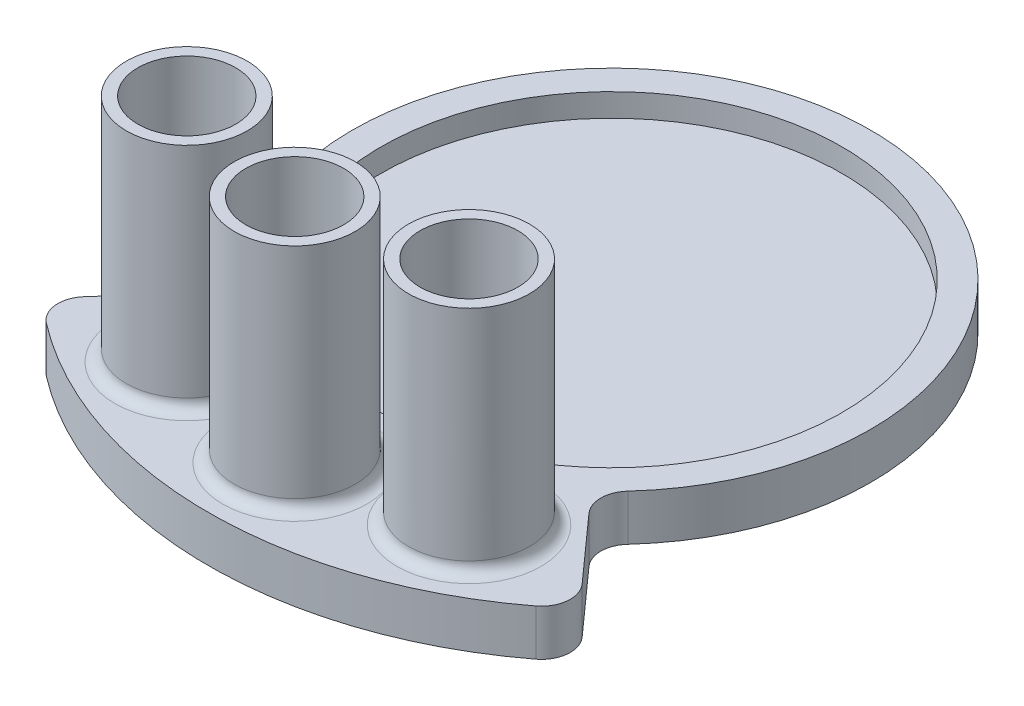
ISO-10303-21;
HEADER;
FILE_DESCRIPTION(('STEP AP214'),'2;1');
FILE_NAME('part.step','',(''),(''),'','','');
FILE_SCHEMA(('AUTOMOTIVE_DESIGN { 1 0 10303 214 1 1 1 1 }'));
ENDSEC;
DATA;
#1=APPLICATION_CONTEXT('core data for automotive mechanical design processes');
#2=APPLICATION_PROTOCOL_DEFINITION('international standard','automotive_design',2000,#1);
#3=PRODUCT_CONTEXT('',#1,'mechanical');
#4=PRODUCT('Part','Part','',(#3));
#5=PRODUCT_RELATED_PRODUCT_CATEGORY('part','',(#4));
#6=PRODUCT_DEFINITION_FORMATION('','',#4);
#7=PRODUCT_DEFINITION_CONTEXT('part definition',#1,'design');
#8=PRODUCT_DEFINITION('design','',#6,#7);
#9=PRODUCT_DEFINITION_SHAPE('','',#8);
#10=(LENGTH_UNIT() NAMED_UNIT(*) SI_UNIT(.MILLI.,.METRE.));
#11=(NAMED_UNIT(*) PLANE_ANGLE_UNIT() SI_UNIT($,.RADIAN.));
#12=(NAMED_UNIT(*) SI_UNIT($,.STERADIAN.) SOLID_ANGLE_UNIT());
#13=UNCERTAINTY_MEASURE_WITH_UNIT(LENGTH_MEASURE(1.E-05),#10,'distance_accuracy_value','');
#14=(GEOMETRIC_REPRESENTATION_CONTEXT(3) GLOBAL_UNCERTAINTY_ASSIGNED_CONTEXT((#13)) GLOBAL_UNIT_ASSIGNED_CONTEXT((#10,
#11,#12)) REPRESENTATION_CONTEXT('',''));
#15=CARTESIAN_POINT('',(0.,0.,0.));
#16=DIRECTION('',(0.,0.,1.));
#17=DIRECTION('',(1.,0.,0.));
#18=AXIS2_PLACEMENT_3D('',#15,#16,#17);
#19=CARTESIAN_POINT('',(0.,8.,0.));
#20=DIRECTION('',(0.,-1.,0.));
#21=DIRECTION('',(0.,0.,-1.));
#22=AXIS2_PLACEMENT_3D('',#19,#20,#21);
#23=CYLINDRICAL_SURFACE('',#22,45.);
#24=CARTESIAN_POINT('',(0.,0.,0.));
#25=DIRECTION('',(0.,1.,0.));
#26=DIRECTION('',(0.,0.,1.));
#27=AXIS2_PLACEMENT_3D('',#24,#25,#26);
#28=CIRCLE('',#27,45.);
#29=CARTESIAN_POINT('',(33.2037250794483,0.,30.3728931919305));
#30=VERTEX_POINT('',#29);
#31=CARTESIAN_POINT('',(-33.2037250794483,0.,30.3728931919305));
#32=VERTEX_POINT('',#31);
#33=EDGE_CURVE('E224',#30,#32,#28,.T.);
#34=ORIENTED_EDGE('',*,*,#33,.T.);
#35=DIRECTION('',(0.,-1.,0.));
#36=VECTOR('',#35,1.);
#37=CARTESIAN_POINT('',(-33.2037250794483,8.,30.3728931919305));
#38=LINE('',#37,#36);
#39=CARTESIAN_POINT('',(-33.2037250794483,8.,30.3728931919305));
#40=VERTEX_POINT('',#39);
#41=EDGE_CURVE('E153',#32,#40,#38,.F.);
#42=ORIENTED_EDGE('',*,*,#41,.T.);
#43=CARTESIAN_POINT('',(0.,8.,0.));
#44=DIRECTION('',(0.,1.,0.));
#45=DIRECTION('',(0.,0.,1.));
#46=AXIS2_PLACEMENT_3D('',#43,#44,#45);
#47=CIRCLE('',#46,45.);
#48=CARTESIAN_POINT('',(33.2037250794483,8.,30.3728931919305));
#49=VERTEX_POINT('',#48);
#50=EDGE_CURVE('E128',#49,#40,#47,.T.);
#51=ORIENTED_EDGE('',*,*,#50,.F.);
#52=DIRECTION('',(0.,-1.,0.));
#53=VECTOR('',#52,1.);
#54=CARTESIAN_POINT('',(33.2037250794483,8.,30.3728931919305));
#55=LINE('',#54,#53);
#56=EDGE_CURVE('E150',#49,#30,#55,.T.);
#57=ORIENTED_EDGE('',*,*,#56,.T.);
#58=EDGE_LOOP('',(#34,#42,#51,#57));
#59=FACE_BOUND('',#58,.T.);
#60=ADVANCED_FACE('F35',(#59),#23,.T.);
#61=CARTESIAN_POINT('',(-30.,8.,33.5410196624968));
#62=DIRECTION('',(0.745355992499929,0.,0.666666666666667));
#63=DIRECTION('',(0.666666666666667,0.,-0.74535599249993));
#64=AXIS2_PLACEMENT_3D('',#61,#62,#63);
#65=PLANE('',#64);
#66=DIRECTION('',(-0.666666666666667,0.,0.745355992499929));
#67=VECTOR('',#66,1.);
#68=CARTESIAN_POINT('',(-30.,0.,33.5410196624968));
#69=LINE('',#68,#67);
#70=CARTESIAN_POINT('',(-33.166247903554,0.,37.0809924354783));
#71=VERTEX_POINT('',#70);
#72=CARTESIAN_POINT('',(-43.2049379893857,0.,48.3045891539648));
#73=VERTEX_POINT('',#72);
#74=EDGE_CURVE('E133',#71,#73,#69,.T.);
#75=ORIENTED_EDGE('',*,*,#74,.T.);
#76=DIRECTION('',(0.,-1.,0.));
#77=VECTOR('',#76,1.);
#78=CARTESIAN_POINT('',(-43.2049379893858,8.,48.3045891539648));
#79=LINE('',#78,#77);
#80=CARTESIAN_POINT('',(-43.2049379893857,8.,48.3045891539648));
#81=VERTEX_POINT('',#80);
#82=EDGE_CURVE('E50',#73,#81,#79,.F.);
#83=ORIENTED_EDGE('',*,*,#82,.T.);
#84=DIRECTION('',(-0.666666666666667,0.,0.745355992499929));
#85=VECTOR('',#84,1.);
#86=CARTESIAN_POINT('',(-30.,8.,33.5410196624968));
#87=LINE('',#86,#85);
#88=CARTESIAN_POINT('',(-33.166247903554,8.,37.0809924354783));
#89=VERTEX_POINT('',#88);
#90=EDGE_CURVE('E131',#89,#81,#87,.T.);
#91=ORIENTED_EDGE('',*,*,#90,.F.);
#92=DIRECTION('',(0.,1.,0.));
#93=VECTOR('',#92,1.);
#94=CARTESIAN_POINT('',(-33.166247903554,0.,37.0809924354783));
#95=LINE('',#94,#93);
#96=EDGE_CURVE('E146',#89,#71,#95,.F.);
#97=ORIENTED_EDGE('',*,*,#96,.T.);
#98=EDGE_LOOP('',(#75,#83,#91,#97));
#99=FACE_BOUND('',#98,.T.);
#100=ADVANCED_FACE('F192',(#99),#65,.F.);
#101=CARTESIAN_POINT('',(0.,8.,0.));
#102=DIRECTION('',(0.,-1.,0.));
#103=DIRECTION('',(0.,0.,-1.));
#104=AXIS2_PLACEMENT_3D('',#101,#102,#103);
#105=CYLINDRICAL_SURFACE('',#104,70.);
#106=CARTESIAN_POINT('',(0.,0.,0.));
#107=DIRECTION('',(0.,1.,0.));
#108=DIRECTION('',(0.,0.,1.));
#109=AXIS2_PLACEMENT_3D('',#106,#107,#108);
#110=CIRCLE('',#109,70.);
#111=CARTESIAN_POINT('',(-42.5149394135696,0.,55.6100703709364));
#112=VERTEX_POINT('',#111);
#113=CARTESIAN_POINT('',(42.5149394135697,0.,55.6100703709364));
#114=VERTEX_POINT('',#113);
#115=EDGE_CURVE('E129',#112,#114,#110,.T.);
#116=ORIENTED_EDGE('',*,*,#115,.T.);
#117=DIRECTION('',(0.,-1.,0.));
#118=VECTOR('',#117,1.);
#119=CARTESIAN_POINT('',(42.5149394135697,8.,55.6100703709364));
#120=LINE('',#119,#118);
#121=CARTESIAN_POINT('',(42.5149394135697,8.,55.6100703709364));
#122=VERTEX_POINT('',#121);
#123=EDGE_CURVE('E107',#114,#122,#120,.F.);
#124=ORIENTED_EDGE('',*,*,#123,.T.);
#125=CARTESIAN_POINT('',(0.,8.,0.));
#126=DIRECTION('',(0.,1.,0.));
#127=DIRECTION('',(0.,0.,1.));
#128=AXIS2_PLACEMENT_3D('',#125,#126,#127);
#129=CIRCLE('',#128,70.);
#130=CARTESIAN_POINT('',(-42.5149394135696,8.,55.6100703709364));
#131=VERTEX_POINT('',#130);
#132=EDGE_CURVE('E231',#131,#122,#129,.T.);
#133=ORIENTED_EDGE('',*,*,#132,.F.);
#134=DIRECTION('',(0.,-1.,0.));
#135=VECTOR('',#134,1.);
#136=CARTESIAN_POINT('',(-42.5149394135696,8.,55.6100703709364));
#137=LINE('',#136,#135);
#138=EDGE_CURVE('E112',#131,#112,#137,.T.);
#139=ORIENTED_EDGE('',*,*,#138,.T.);
#140=EDGE_LOOP('',(#116,#124,#133,#139));
#141=FACE_BOUND('',#140,.T.);
#142=ADVANCED_FACE('F198',(#141),#105,.T.);
#143=CARTESIAN_POINT('',(30.,8.,33.5410196624968));
#144=DIRECTION('',(-0.745355992499929,0.,0.666666666666667));
#145=DIRECTION('',(0.666666666666667,0.,0.745355992499929));
#146=AXIS2_PLACEMENT_3D('',#143,#144,#145);
#147=PLANE('',#146);
#148=DIRECTION('',(-0.666666666666667,0.,-0.745355992499929));
#149=VECTOR('',#148,1.);
#150=CARTESIAN_POINT('',(30.,8.,33.5410196624968));
#151=LINE('',#150,#149);
#152=CARTESIAN_POINT('',(43.2049379893858,8.,48.3045891539648));
#153=VERTEX_POINT('',#152);
#154=CARTESIAN_POINT('',(33.166247903554,8.,37.0809924354783));
#155=VERTEX_POINT('',#154);
#156=EDGE_CURVE('E122',#153,#155,#151,.T.);
#157=ORIENTED_EDGE('',*,*,#156,.F.);
#158=DIRECTION('',(0.,-1.,0.));
#159=VECTOR('',#158,1.);
#160=CARTESIAN_POINT('',(43.2049379893858,8.,48.3045891539648));
#161=LINE('',#160,#159);
#162=CARTESIAN_POINT('',(43.2049379893858,0.,48.3045891539648));
#163=VERTEX_POINT('',#162);
#164=EDGE_CURVE('E106',#153,#163,#161,.T.);
#165=ORIENTED_EDGE('',*,*,#164,.T.);
#166=DIRECTION('',(-0.666666666666667,0.,-0.745355992499929));
#167=VECTOR('',#166,1.);
#168=CARTESIAN_POINT('',(30.,0.,33.5410196624968));
#169=LINE('',#168,#167);
#170=CARTESIAN_POINT('',(33.166247903554,0.,37.0809924354783));
#171=VERTEX_POINT('',#170);
#172=EDGE_CURVE('E119',#163,#171,#169,.T.);
#173=ORIENTED_EDGE('',*,*,#172,.T.);
#174=DIRECTION('',(0.,1.,0.));
#175=VECTOR('',#174,1.);
#176=CARTESIAN_POINT('',(33.166247903554,8.,37.0809924354783));
#177=LINE('',#176,#175);
#178=EDGE_CURVE('E123',#171,#155,#177,.T.);
#179=ORIENTED_EDGE('',*,*,#178,.T.);
#180=EDGE_LOOP('',(#157,#165,#173,#179));
#181=FACE_BOUND('',#180,.T.);
#182=ADVANCED_FACE('F118',(#181),#147,.F.);
#183=CARTESIAN_POINT('',(0.,8.,0.));
#184=DIRECTION('',(0.,1.,0.));
#185=DIRECTION('',(0.,0.,1.));
#186=AXIS2_PLACEMENT_3D('',#183,#184,#185);
#187=PLANE('',#186);
#188=CARTESIAN_POINT('',(24.5,8.,49.2417505781425));
#189=DIRECTION('',(0.,1.,0.));
#190=DIRECTION('',(0.,0.,1.));
#191=AXIS2_PLACEMENT_3D('',#188,#189,#190);
#192=CIRCLE('',#191,12.5);
#193=CARTESIAN_POINT('',(24.5,8.,61.7417505781425));
#194=VERTEX_POINT('',#193);
#195=EDGE_CURVE('E170',#194,#194,#192,.F.);
#196=ORIENTED_EDGE('',*,*,#195,.T.);
#197=EDGE_LOOP('',(#196));
#198=FACE_BOUND('',#197,.T.);
#199=CARTESIAN_POINT('',(0.,8.,55.));
#200=DIRECTION('',(0.,1.,0.));
#201=DIRECTION('',(0.,0.,1.));
#202=AXIS2_PLACEMENT_3D('',#199,#200,#201);
#203=CIRCLE('',#202,12.5);
#204=CARTESIAN_POINT('',(0.,8.,67.5));
#205=VERTEX_POINT('',#204);
#206=EDGE_CURVE('E167',#205,#205,#203,.F.);
#207=ORIENTED_EDGE('',*,*,#206,.T.);
#208=EDGE_LOOP('',(#207));
#209=FACE_BOUND('',#208,.T.);
#210=CARTESIAN_POINT('',(-24.5,8.,49.2417505781425));
#211=DIRECTION('',(0.,1.,0.));
#212=DIRECTION('',(0.,0.,1.));
#213=AXIS2_PLACEMENT_3D('',#210,#211,#212);
#214=CIRCLE('',#213,12.5);
#215=CARTESIAN_POINT('',(-24.5,8.,61.7417505781425));
#216=VERTEX_POINT('',#215);
#217=EDGE_CURVE('E164',#216,#216,#214,.F.);
#218=ORIENTED_EDGE('',*,*,#217,.T.);
#219=EDGE_LOOP('',(#218));
#220=FACE_BOUND('',#219,.T.);
#221=CARTESIAN_POINT('',(0.,8.,0.));
#222=DIRECTION('',(0.,1.,0.));
#223=DIRECTION('',(0.,0.,1.));
#224=AXIS2_PLACEMENT_3D('',#221,#222,#223);
#225=CIRCLE('',#224,40.);
#226=CARTESIAN_POINT('',(0.,8.,40.));
#227=VERTEX_POINT('',#226);
#228=EDGE_CURVE('E234',#227,#227,#225,.T.);
#229=ORIENTED_EDGE('',*,*,#228,.F.);
#230=EDGE_LOOP('',(#229));
#231=FACE_BOUND('',#230,.T.);
#232=ORIENTED_EDGE('',*,*,#132,.T.);
#233=CARTESIAN_POINT('',(39.4781580268861,8.,51.6379224872981));
#234=DIRECTION('',(0.,1.,0.));
#235=DIRECTION('',(0.,0.,1.));
#236=AXIS2_PLACEMENT_3D('',#233,#234,#235);
#237=CIRCLE('',#236,5.);
#238=EDGE_CURVE('E144',#122,#153,#237,.T.);
#239=ORIENTED_EDGE('',*,*,#238,.T.);
#240=ORIENTED_EDGE('',*,*,#156,.T.);
#241=CARTESIAN_POINT('',(36.8930278660537,8.,33.747659102145));
#242=DIRECTION('',(0.,1.,0.));
#243=DIRECTION('',(0.,0.,1.));
#244=AXIS2_PLACEMENT_3D('',#241,#242,#243);
#245=CIRCLE('',#244,5.);
#246=EDGE_CURVE('E159',#155,#49,#245,.F.);
#247=ORIENTED_EDGE('',*,*,#246,.T.);
#248=ORIENTED_EDGE('',*,*,#50,.T.);
#249=CARTESIAN_POINT('',(-36.8930278660537,8.,33.747659102145));
#250=DIRECTION('',(0.,1.,0.));
#251=DIRECTION('',(0.,0.,1.));
#252=AXIS2_PLACEMENT_3D('',#249,#250,#251);
#253=CIRCLE('',#252,5.);
#254=EDGE_CURVE('E57',#40,#89,#253,.F.);
#255=ORIENTED_EDGE('',*,*,#254,.T.);
#256=ORIENTED_EDGE('',*,*,#90,.T.);
#257=CARTESIAN_POINT('',(-39.4781580268861,8.,51.6379224872981));
#258=DIRECTION('',(0.,1.,0.));
#259=DIRECTION('',(0.,0.,1.));
#260=AXIS2_PLACEMENT_3D('',#257,#258,#259);
#261=CIRCLE('',#260,5.);
#262=EDGE_CURVE('E142',#81,#131,#261,.T.);
#263=ORIENTED_EDGE('',*,*,#262,.T.);
#264=EDGE_LOOP('',(#232,#239,#240,#247,#248,#255,#256,#263));
#265=FACE_BOUND('',#264,.T.);
#266=ADVANCED_FACE('F222',(#198,#209,#220,#231,#265),#187,.T.);
#267=CARTESIAN_POINT('',(0.,0.,0.));
#268=DIRECTION('',(0.,1.,0.));
#269=DIRECTION('',(0.,0.,1.));
#270=AXIS2_PLACEMENT_3D('',#267,#268,#269);
#271=PLANE('',#270);
#272=ORIENTED_EDGE('',*,*,#172,.F.);
#273=CARTESIAN_POINT('',(39.4781580268861,0.,51.6379224872981));
#274=DIRECTION('',(0.,1.,0.));
#275=DIRECTION('',(0.,0.,1.));
#276=AXIS2_PLACEMENT_3D('',#273,#274,#275);
#277=CIRCLE('',#276,5.);
#278=EDGE_CURVE('E102',#163,#114,#277,.F.);
#279=ORIENTED_EDGE('',*,*,#278,.T.);
#280=ORIENTED_EDGE('',*,*,#115,.F.);
#281=CARTESIAN_POINT('',(-39.4781580268861,0.,51.6379224872981));
#282=DIRECTION('',(0.,1.,0.));
#283=DIRECTION('',(0.,0.,1.));
#284=AXIS2_PLACEMENT_3D('',#281,#282,#283);
#285=CIRCLE('',#284,5.);
#286=EDGE_CURVE('E113',#112,#73,#285,.F.);
#287=ORIENTED_EDGE('',*,*,#286,.T.);
#288=ORIENTED_EDGE('',*,*,#74,.F.);
#289=CARTESIAN_POINT('',(-36.8930278660537,0.,33.747659102145));
#290=DIRECTION('',(0.,1.,0.));
#291=DIRECTION('',(0.,0.,1.));
#292=AXIS2_PLACEMENT_3D('',#289,#290,#291);
#293=CIRCLE('',#292,5.);
#294=EDGE_CURVE('E155',#71,#32,#293,.T.);
#295=ORIENTED_EDGE('',*,*,#294,.T.);
#296=ORIENTED_EDGE('',*,*,#33,.F.);
#297=CARTESIAN_POINT('',(36.8930278660537,0.,33.747659102145));
#298=DIRECTION('',(0.,1.,0.));
#299=DIRECTION('',(0.,0.,1.));
#300=AXIS2_PLACEMENT_3D('',#297,#298,#299);
#301=CIRCLE('',#300,5.);
#302=EDGE_CURVE('E127',#30,#171,#301,.T.);
#303=ORIENTED_EDGE('',*,*,#302,.T.);
#304=EDGE_LOOP('',(#272,#279,#280,#287,#288,#295,#296,#303));
#305=FACE_BOUND('',#304,.T.);
#306=ADVANCED_FACE('F125',(#305),#271,.F.);
#307=CARTESIAN_POINT('',(0.,4.,0.));
#308=DIRECTION('',(0.,1.,0.));
#309=DIRECTION('',(0.,0.,1.));
#310=AXIS2_PLACEMENT_3D('',#307,#308,#309);
#311=CYLINDRICAL_SURFACE('',#310,40.);
#312=CARTESIAN_POINT('',(0.,4.,0.));
#313=DIRECTION('',(0.,1.,0.));
#314=DIRECTION('',(0.,0.,1.));
#315=AXIS2_PLACEMENT_3D('',#312,#313,#314);
#316=CIRCLE('',#315,40.);
#317=CARTESIAN_POINT('',(0.,4.,40.));
#318=VERTEX_POINT('',#317);
#319=EDGE_CURVE('E227',#318,#318,#316,.T.);
#320=ORIENTED_EDGE('',*,*,#319,.F.);
#321=EDGE_LOOP('',(#320));
#322=FACE_BOUND('',#321,.T.);
#323=ORIENTED_EDGE('',*,*,#228,.T.);
#324=EDGE_LOOP('',(#323));
#325=FACE_BOUND('',#324,.T.);
#326=ADVANCED_FACE('F300',(#322,#325),#311,.F.);
#327=CARTESIAN_POINT('',(0.,4.,0.));
#328=DIRECTION('',(0.,1.,0.));
#329=DIRECTION('',(0.,0.,1.));
#330=AXIS2_PLACEMENT_3D('',#327,#328,#329);
#331=PLANE('',#330);
#332=ORIENTED_EDGE('',*,*,#319,.T.);
#333=EDGE_LOOP('',(#332));
#334=FACE_BOUND('',#333,.T.);
#335=ADVANCED_FACE('F297',(#334),#331,.T.);
#336=CARTESIAN_POINT('',(0.,48.,55.));
#337=DIRECTION('',(0.,-1.,0.));
#338=DIRECTION('',(0.,0.,-1.));
#339=AXIS2_PLACEMENT_3D('',#336,#337,#338);
#340=CYLINDRICAL_SURFACE('',#339,10.5);
#341=CARTESIAN_POINT('',(0.,10.,55.));
#342=DIRECTION('',(0.,1.,0.));
#343=DIRECTION('',(0.,0.,1.));
#344=AXIS2_PLACEMENT_3D('',#341,#342,#343);
#345=CIRCLE('',#344,10.5);
#346=CARTESIAN_POINT('',(0.,10.,65.5));
#347=VERTEX_POINT('',#346);
#348=EDGE_CURVE('E43',#347,#347,#345,.T.);
#349=ORIENTED_EDGE('',*,*,#348,.T.);
#350=EDGE_LOOP('',(#349));
#351=FACE_BOUND('',#350,.T.);
#352=CARTESIAN_POINT('',(0.,48.,55.));
#353=DIRECTION('',(0.,1.,0.));
#354=DIRECTION('',(0.,0.,1.));
#355=AXIS2_PLACEMENT_3D('',#352,#353,#354);
#356=CIRCLE('',#355,10.5);
#357=CARTESIAN_POINT('',(0.,48.,65.5));
#358=VERTEX_POINT('',#357);
#359=EDGE_CURVE('E237',#358,#358,#356,.T.);
#360=ORIENTED_EDGE('',*,*,#359,.F.);
#361=EDGE_LOOP('',(#360));
#362=FACE_BOUND('',#361,.T.);
#363=ADVANCED_FACE('F175',(#351,#362),#340,.T.);
#364=CARTESIAN_POINT('',(0.,48.,55.));
#365=DIRECTION('',(0.,1.,0.));
#366=DIRECTION('',(0.,0.,1.));
#367=AXIS2_PLACEMENT_3D('',#364,#365,#366);
#368=PLANE('',#367);
#369=CARTESIAN_POINT('',(0.,48.,55.));
#370=DIRECTION('',(0.,1.,0.));
#371=DIRECTION('',(0.,0.,1.));
#372=AXIS2_PLACEMENT_3D('',#369,#370,#371);
#373=CIRCLE('',#372,8.5);
#374=CARTESIAN_POINT('',(0.,48.,63.5));
#375=VERTEX_POINT('',#374);
#376=EDGE_CURVE('E249',#375,#375,#373,.T.);
#377=ORIENTED_EDGE('',*,*,#376,.F.);
#378=EDGE_LOOP('',(#377));
#379=FACE_BOUND('',#378,.T.);
#380=ORIENTED_EDGE('',*,*,#359,.T.);
#381=EDGE_LOOP('',(#380));
#382=FACE_BOUND('',#381,.T.);
#383=ADVANCED_FACE('F285',(#379,#382),#368,.T.);
#384=CARTESIAN_POINT('',(-24.5,48.,49.2417505781425));
#385=DIRECTION('',(0.,-1.,0.));
#386=DIRECTION('',(0.,0.,-1.));
#387=AXIS2_PLACEMENT_3D('',#384,#385,#386);
#388=CYLINDRICAL_SURFACE('',#387,10.5);
#389=CARTESIAN_POINT('',(-24.5,10.,49.2417505781425));
#390=DIRECTION('',(0.,1.,0.));
#391=DIRECTION('',(0.,0.,1.));
#392=AXIS2_PLACEMENT_3D('',#389,#390,#391);
#393=CIRCLE('',#392,10.5);
#394=CARTESIAN_POINT('',(-24.5,10.,59.7417505781425));
#395=VERTEX_POINT('',#394);
#396=EDGE_CURVE('E11',#395,#395,#393,.T.);
#397=ORIENTED_EDGE('',*,*,#396,.T.);
#398=EDGE_LOOP('',(#397));
#399=FACE_BOUND('',#398,.T.);
#400=CARTESIAN_POINT('',(-24.5,48.,49.2417505781425));
#401=DIRECTION('',(0.,1.,0.));
#402=DIRECTION('',(0.,0.,1.));
#403=AXIS2_PLACEMENT_3D('',#400,#401,#402);
#404=CIRCLE('',#403,10.5);
#405=CARTESIAN_POINT('',(-24.5,48.,59.7417505781425));
#406=VERTEX_POINT('',#405);
#407=EDGE_CURVE('E242',#406,#406,#404,.T.);
#408=ORIENTED_EDGE('',*,*,#407,.F.);
#409=EDGE_LOOP('',(#408));
#410=FACE_BOUND('',#409,.T.);
#411=ADVANCED_FACE('F280',(#399,#410),#388,.T.);
#412=CARTESIAN_POINT('',(-24.5,48.,49.2417505781425));
#413=DIRECTION('',(0.,1.,0.));
#414=DIRECTION('',(0.,0.,1.));
#415=AXIS2_PLACEMENT_3D('',#412,#413,#414);
#416=PLANE('',#415);
#417=CARTESIAN_POINT('',(-24.5,48.,49.2417505781425));
#418=DIRECTION('',(0.,1.,0.));
#419=DIRECTION('',(0.,0.,1.));
#420=AXIS2_PLACEMENT_3D('',#417,#418,#419);
#421=CIRCLE('',#420,8.5);
#422=CARTESIAN_POINT('',(-24.5,48.,57.7417505781425));
#423=VERTEX_POINT('',#422);
#424=EDGE_CURVE('E261',#423,#423,#421,.T.);
#425=ORIENTED_EDGE('',*,*,#424,.F.);
#426=EDGE_LOOP('',(#425));
#427=FACE_BOUND('',#426,.T.);
#428=ORIENTED_EDGE('',*,*,#407,.T.);
#429=EDGE_LOOP('',(#428));
#430=FACE_BOUND('',#429,.T.);
#431=ADVANCED_FACE('F276',(#427,#430),#416,.T.);
#432=CARTESIAN_POINT('',(24.5,48.,49.2417505781425));
#433=DIRECTION('',(0.,-1.,0.));
#434=DIRECTION('',(0.,0.,-1.));
#435=AXIS2_PLACEMENT_3D('',#432,#433,#434);
#436=CYLINDRICAL_SURFACE('',#435,10.5);
#437=CARTESIAN_POINT('',(24.5,10.,49.2417505781425));
#438=DIRECTION('',(0.,1.,0.));
#439=DIRECTION('',(0.,0.,1.));
#440=AXIS2_PLACEMENT_3D('',#437,#438,#439);
#441=CIRCLE('',#440,10.5);
#442=CARTESIAN_POINT('',(24.5,10.,59.7417505781425));
#443=VERTEX_POINT('',#442);
#444=EDGE_CURVE('E161',#443,#443,#441,.T.);
#445=ORIENTED_EDGE('',*,*,#444,.T.);
#446=EDGE_LOOP('',(#445));
#447=FACE_BOUND('',#446,.T.);
#448=CARTESIAN_POINT('',(24.5,48.,49.2417505781425));
#449=DIRECTION('',(0.,1.,0.));
#450=DIRECTION('',(0.,0.,-1.));
#451=AXIS2_PLACEMENT_3D('',#448,#449,#450);
#452=CIRCLE('',#451,10.5);
#453=CARTESIAN_POINT('',(24.5,48.,38.7417505781425));
#454=VERTEX_POINT('',#453);
#455=EDGE_CURVE('E245',#454,#454,#452,.T.);
#456=ORIENTED_EDGE('',*,*,#455,.F.);
#457=EDGE_LOOP('',(#456));
#458=FACE_BOUND('',#457,.T.);
#459=ADVANCED_FACE('F279',(#447,#458),#436,.T.);
#460=CARTESIAN_POINT('',(24.5,48.,49.2417505781425));
#461=DIRECTION('',(0.,-1.,0.));
#462=DIRECTION('',(0.,0.,-1.));
#463=AXIS2_PLACEMENT_3D('',#460,#461,#462);
#464=PLANE('',#463);
#465=CARTESIAN_POINT('',(24.5,48.,49.2417505781425));
#466=DIRECTION('',(0.,1.,0.));
#467=DIRECTION('',(0.,0.,1.));
#468=AXIS2_PLACEMENT_3D('',#465,#466,#467);
#469=CIRCLE('',#468,8.5);
#470=CARTESIAN_POINT('',(24.5,48.,57.7417505781425));
#471=VERTEX_POINT('',#470);
#472=EDGE_CURVE('E255',#471,#471,#469,.T.);
#473=ORIENTED_EDGE('',*,*,#472,.F.);
#474=EDGE_LOOP('',(#473));
#475=FACE_BOUND('',#474,.T.);
#476=ORIENTED_EDGE('',*,*,#455,.T.);
#477=EDGE_LOOP('',(#476));
#478=FACE_BOUND('',#477,.T.);
#479=ADVANCED_FACE('F367',(#475,#478),#464,.F.);
#480=CARTESIAN_POINT('',(24.5,8.,49.2417505781425));
#481=DIRECTION('',(0.,1.,0.));
#482=DIRECTION('',(0.,0.,1.));
#483=AXIS2_PLACEMENT_3D('',#480,#481,#482);
#484=CYLINDRICAL_SURFACE('',#483,8.5);
#485=CARTESIAN_POINT('',(24.5,8.,49.2417505781425));
#486=DIRECTION('',(0.,1.,0.));
#487=DIRECTION('',(0.,0.,1.));
#488=AXIS2_PLACEMENT_3D('',#485,#486,#487);
#489=CIRCLE('',#488,8.5);
#490=CARTESIAN_POINT('',(24.5,8.,57.7417505781425));
#491=VERTEX_POINT('',#490);
#492=EDGE_CURVE('E258',#491,#491,#489,.T.);
#493=ORIENTED_EDGE('',*,*,#492,.F.);
#494=EDGE_LOOP('',(#493));
#495=FACE_BOUND('',#494,.T.);
#496=ORIENTED_EDGE('',*,*,#472,.T.);
#497=EDGE_LOOP('',(#496));
#498=FACE_BOUND('',#497,.T.);
#499=ADVANCED_FACE('F372',(#495,#498),#484,.F.);
#500=CARTESIAN_POINT('',(24.5,8.,49.2417505781425));
#501=DIRECTION('',(0.,1.,0.));
#502=DIRECTION('',(0.,0.,1.));
#503=AXIS2_PLACEMENT_3D('',#500,#501,#502);
#504=PLANE('',#503);
#505=ORIENTED_EDGE('',*,*,#492,.T.);
#506=EDGE_LOOP('',(#505));
#507=FACE_BOUND('',#506,.T.);
#508=ADVANCED_FACE('F272',(#507),#504,.T.);
#509=CARTESIAN_POINT('',(-24.5,8.,49.2417505781425));
#510=DIRECTION('',(0.,1.,0.));
#511=DIRECTION('',(0.,0.,1.));
#512=AXIS2_PLACEMENT_3D('',#509,#510,#511);
#513=CYLINDRICAL_SURFACE('',#512,8.5);
#514=CARTESIAN_POINT('',(-24.5,8.,49.2417505781425));
#515=DIRECTION('',(0.,1.,0.));
#516=DIRECTION('',(0.,0.,1.));
#517=AXIS2_PLACEMENT_3D('',#514,#515,#516);
#518=CIRCLE('',#517,8.5);
#519=CARTESIAN_POINT('',(-24.5,8.,57.7417505781425));
#520=VERTEX_POINT('',#519);
#521=EDGE_CURVE('E252',#520,#520,#518,.T.);
#522=ORIENTED_EDGE('',*,*,#521,.F.);
#523=EDGE_LOOP('',(#522));
#524=FACE_BOUND('',#523,.T.);
#525=ORIENTED_EDGE('',*,*,#424,.T.);
#526=EDGE_LOOP('',(#525));
#527=FACE_BOUND('',#526,.T.);
#528=ADVANCED_FACE('F269',(#524,#527),#513,.F.);
#529=CARTESIAN_POINT('',(-24.5,8.,49.2417505781425));
#530=DIRECTION('',(0.,1.,0.));
#531=DIRECTION('',(0.,0.,1.));
#532=AXIS2_PLACEMENT_3D('',#529,#530,#531);
#533=PLANE('',#532);
#534=ORIENTED_EDGE('',*,*,#521,.T.);
#535=EDGE_LOOP('',(#534));
#536=FACE_BOUND('',#535,.T.);
#537=ADVANCED_FACE('F267',(#536),#533,.T.);
#538=CARTESIAN_POINT('',(0.,8.,55.));
#539=DIRECTION('',(0.,1.,0.));
#540=DIRECTION('',(0.,0.,1.));
#541=AXIS2_PLACEMENT_3D('',#538,#539,#540);
#542=CYLINDRICAL_SURFACE('',#541,8.5);
#543=CARTESIAN_POINT('',(0.,8.,55.));
#544=DIRECTION('',(0.,1.,0.));
#545=DIRECTION('',(0.,0.,1.));
#546=AXIS2_PLACEMENT_3D('',#543,#544,#545);
#547=CIRCLE('',#546,8.5);
#548=CARTESIAN_POINT('',(0.,8.,63.5));
#549=VERTEX_POINT('',#548);
#550=EDGE_CURVE('E248',#549,#549,#547,.T.);
#551=ORIENTED_EDGE('',*,*,#550,.F.);
#552=EDGE_LOOP('',(#551));
#553=FACE_BOUND('',#552,.T.);
#554=ORIENTED_EDGE('',*,*,#376,.T.);
#555=EDGE_LOOP('',(#554));
#556=FACE_BOUND('',#555,.T.);
#557=ADVANCED_FACE('F406',(#553,#556),#542,.F.);
#558=CARTESIAN_POINT('',(0.,8.,55.));
#559=DIRECTION('',(0.,1.,0.));
#560=DIRECTION('',(0.,0.,1.));
#561=AXIS2_PLACEMENT_3D('',#558,#559,#560);
#562=PLANE('',#561);
#563=ORIENTED_EDGE('',*,*,#550,.T.);
#564=EDGE_LOOP('',(#563));
#565=FACE_BOUND('',#564,.T.);
#566=ADVANCED_FACE('F206',(#565),#562,.T.);
#567=CARTESIAN_POINT('',(39.4781580268861,8.,51.6379224872981));
#568=DIRECTION('',(0.,-1.,0.));
#569=DIRECTION('',(0.,0.,-1.));
#570=AXIS2_PLACEMENT_3D('',#567,#568,#569);
#571=CYLINDRICAL_SURFACE('',#570,5.);
#572=ORIENTED_EDGE('',*,*,#238,.F.);
#573=ORIENTED_EDGE('',*,*,#123,.F.);
#574=ORIENTED_EDGE('',*,*,#278,.F.);
#575=ORIENTED_EDGE('',*,*,#164,.F.);
#576=EDGE_LOOP('',(#572,#573,#574,#575));
#577=FACE_BOUND('',#576,.T.);
#578=ADVANCED_FACE('F105',(#577),#571,.T.);
#579=CARTESIAN_POINT('',(-39.4781580268861,8.,51.6379224872981));
#580=DIRECTION('',(0.,-1.,0.));
#581=DIRECTION('',(0.,0.,-1.));
#582=AXIS2_PLACEMENT_3D('',#579,#580,#581);
#583=CYLINDRICAL_SURFACE('',#582,5.);
#584=ORIENTED_EDGE('',*,*,#262,.F.);
#585=ORIENTED_EDGE('',*,*,#82,.F.);
#586=ORIENTED_EDGE('',*,*,#286,.F.);
#587=ORIENTED_EDGE('',*,*,#138,.F.);
#588=EDGE_LOOP('',(#584,#585,#586,#587));
#589=FACE_BOUND('',#588,.T.);
#590=ADVANCED_FACE('F205',(#589),#583,.T.);
#591=CARTESIAN_POINT('',(-36.8930278660537,8.,33.747659102145));
#592=DIRECTION('',(0.,-1.,0.));
#593=DIRECTION('',(0.,0.,-1.));
#594=AXIS2_PLACEMENT_3D('',#591,#592,#593);
#595=CYLINDRICAL_SURFACE('',#594,5.);
#596=ORIENTED_EDGE('',*,*,#254,.F.);
#597=ORIENTED_EDGE('',*,*,#41,.F.);
#598=ORIENTED_EDGE('',*,*,#294,.F.);
#599=ORIENTED_EDGE('',*,*,#96,.F.);
#600=EDGE_LOOP('',(#596,#597,#598,#599));
#601=FACE_BOUND('',#600,.T.);
#602=ADVANCED_FACE('F209',(#601),#595,.F.);
#603=CARTESIAN_POINT('',(36.8930278660537,8.,33.747659102145));
#604=DIRECTION('',(0.,-1.,0.));
#605=DIRECTION('',(0.,0.,-1.));
#606=AXIS2_PLACEMENT_3D('',#603,#604,#605);
#607=CYLINDRICAL_SURFACE('',#606,5.);
#608=ORIENTED_EDGE('',*,*,#246,.F.);
#609=ORIENTED_EDGE('',*,*,#178,.F.);
#610=ORIENTED_EDGE('',*,*,#302,.F.);
#611=ORIENTED_EDGE('',*,*,#56,.F.);
#612=EDGE_LOOP('',(#608,#609,#610,#611));
#613=FACE_BOUND('',#612,.T.);
#614=ADVANCED_FACE('F187',(#613),#607,.F.);
#615=CARTESIAN_POINT('',(24.5,10.,49.2417505781425));
#616=DIRECTION('',(0.,1.,0.));
#617=DIRECTION('',(0.,0.,1.));
#618=AXIS2_PLACEMENT_3D('',#615,#616,#617);
#619=TOROIDAL_SURFACE('',#618,12.5,2.);
#620=ORIENTED_EDGE('',*,*,#195,.F.);
#621=EDGE_LOOP('',(#620));
#622=FACE_BOUND('',#621,.T.);
#623=ORIENTED_EDGE('',*,*,#444,.F.);
#624=EDGE_LOOP('',(#623));
#625=FACE_BOUND('',#624,.T.);
#626=ADVANCED_FACE('F180',(#622,#625),#619,.F.);
#627=CARTESIAN_POINT('',(0.,10.,55.));
#628=DIRECTION('',(0.,1.,0.));
#629=DIRECTION('',(0.,0.,1.));
#630=AXIS2_PLACEMENT_3D('',#627,#628,#629);
#631=TOROIDAL_SURFACE('',#630,12.5,2.);
#632=ORIENTED_EDGE('',*,*,#206,.F.);
#633=EDGE_LOOP('',(#632));
#634=FACE_BOUND('',#633,.T.);
#635=ORIENTED_EDGE('',*,*,#348,.F.);
#636=EDGE_LOOP('',(#635));
#637=FACE_BOUND('',#636,.T.);
#638=ADVANCED_FACE('F178',(#634,#637),#631,.F.);
#639=CARTESIAN_POINT('',(-24.5,10.,49.2417505781425));
#640=DIRECTION('',(0.,1.,0.));
#641=DIRECTION('',(0.,0.,1.));
#642=AXIS2_PLACEMENT_3D('',#639,#640,#641);
#643=TOROIDAL_SURFACE('',#642,12.5,2.);
#644=ORIENTED_EDGE('',*,*,#217,.F.);
#645=EDGE_LOOP('',(#644));
#646=FACE_BOUND('',#645,.T.);
#647=ORIENTED_EDGE('',*,*,#396,.F.);
#648=EDGE_LOOP('',(#647));
#649=FACE_BOUND('',#648,.T.);
#650=ADVANCED_FACE('F37',(#646,#649),#643,.F.);
#651=CLOSED_SHELL('',(#60,#100,#142,#182,#266,#306,#326,#335,#363,#383,#411,#431,#459,#479,#499,
#508,#528,#537,#557,#566,#578,#590,#602,#614,#626,#638,#650));
#652=MANIFOLD_SOLID_BREP('B2',#651);
#653=ADVANCED_BREP_SHAPE_REPRESENTATION('',(#18,#652),#14);
#654=SHAPE_DEFINITION_REPRESENTATION(#9,#653);
ENDSEC;
END-ISO-10303-21;
